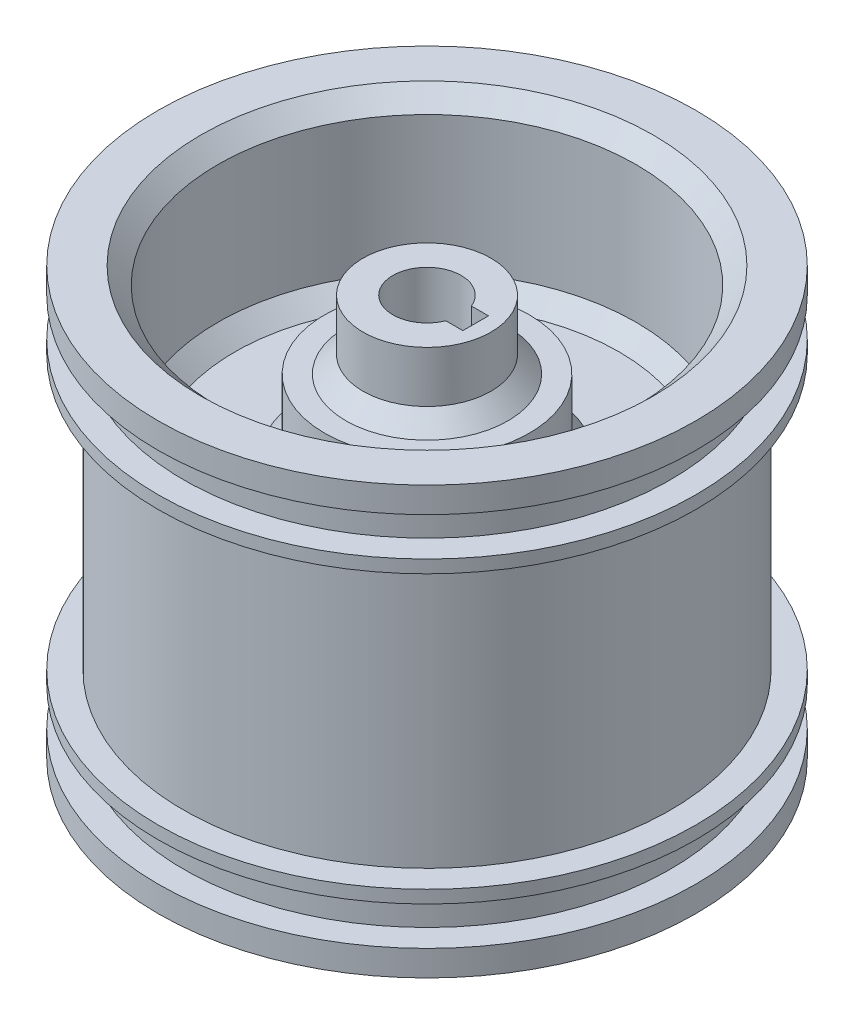
ISO-10303-21;
HEADER;
FILE_DESCRIPTION(('STEP AP214'),'2;1');
FILE_NAME('part.step','',(''),(''),'','','');
FILE_SCHEMA(('AUTOMOTIVE_DESIGN { 1 0 10303 214 1 1 1 1 }'));
ENDSEC;
DATA;
#1=APPLICATION_CONTEXT('core data for automotive mechanical design processes');
#2=APPLICATION_PROTOCOL_DEFINITION('international standard','automotive_design',2000,#1);
#3=PRODUCT_CONTEXT('',#1,'mechanical');
#4=PRODUCT('Part','Part','',(#3));
#5=PRODUCT_RELATED_PRODUCT_CATEGORY('part','',(#4));
#6=PRODUCT_DEFINITION_FORMATION('','',#4);
#7=PRODUCT_DEFINITION_CONTEXT('part definition',#1,'design');
#8=PRODUCT_DEFINITION('design','',#6,#7);
#9=PRODUCT_DEFINITION_SHAPE('','',#8);
#10=(LENGTH_UNIT() NAMED_UNIT(*) SI_UNIT(.MILLI.,.METRE.));
#11=(NAMED_UNIT(*) PLANE_ANGLE_UNIT() SI_UNIT($,.RADIAN.));
#12=(NAMED_UNIT(*) SI_UNIT($,.STERADIAN.) SOLID_ANGLE_UNIT());
#13=UNCERTAINTY_MEASURE_WITH_UNIT(LENGTH_MEASURE(1.E-05),#10,'distance_accuracy_value','');
#14=(GEOMETRIC_REPRESENTATION_CONTEXT(3) GLOBAL_UNCERTAINTY_ASSIGNED_CONTEXT((#13)) GLOBAL_UNIT_ASSIGNED_CONTEXT((#10,
#11,#12)) REPRESENTATION_CONTEXT('',''));
#15=CARTESIAN_POINT('',(0.,0.,0.));
#16=DIRECTION('',(0.,0.,1.));
#17=DIRECTION('',(1.,0.,0.));
#18=AXIS2_PLACEMENT_3D('',#15,#16,#17);
#19=CARTESIAN_POINT('',(5.7,-53.,0.));
#20=DIRECTION('',(-1.,0.,0.));
#21=DIRECTION('',(0.,0.,1.));
#22=AXIS2_PLACEMENT_3D('',#19,#20,#21);
#23=PLANE('',#22);
#24=DIRECTION('',(0.,1.,0.));
#25=VECTOR('',#24,1.);
#26=CARTESIAN_POINT('',(5.7,-53.,-1.5));
#27=LINE('',#26,#25);
#28=CARTESIAN_POINT('',(5.7,-30.,-1.5));
#29=VERTEX_POINT('',#28);
#30=CARTESIAN_POINT('',(5.7,-3.00000000000001,-1.5));
#31=VERTEX_POINT('',#30);
#32=EDGE_CURVE('E187',#29,#31,#27,.T.);
#33=ORIENTED_EDGE('',*,*,#32,.F.);
#34=DIRECTION('',(0.,0.,1.));
#35=VECTOR('',#34,1.);
#36=CARTESIAN_POINT('',(5.7,-30.,0.));
#37=LINE('',#36,#35);
#38=CARTESIAN_POINT('',(5.7,-30.,1.5));
#39=VERTEX_POINT('',#38);
#40=EDGE_CURVE('E61',#29,#39,#37,.T.);
#41=ORIENTED_EDGE('',*,*,#40,.T.);
#42=DIRECTION('',(0.,1.,0.));
#43=VECTOR('',#42,1.);
#44=CARTESIAN_POINT('',(5.7,-53.,1.5));
#45=LINE('',#44,#43);
#46=CARTESIAN_POINT('',(5.7,-3.00000000000001,1.5));
#47=VERTEX_POINT('',#46);
#48=EDGE_CURVE('E188',#39,#47,#45,.T.);
#49=ORIENTED_EDGE('',*,*,#48,.T.);
#50=DIRECTION('',(0.,0.,1.));
#51=VECTOR('',#50,1.);
#52=CARTESIAN_POINT('',(5.7,-3.00000000000001,0.));
#53=LINE('',#52,#51);
#54=EDGE_CURVE('E175',#31,#47,#53,.T.);
#55=ORIENTED_EDGE('',*,*,#54,.F.);
#56=EDGE_LOOP('',(#33,#41,#49,#55));
#57=FACE_BOUND('',#56,.T.);
#58=ADVANCED_FACE('F38',(#57),#23,.T.);
#59=CARTESIAN_POINT('',(0.,-53.,1.5));
#60=DIRECTION('',(0.,0.,-1.));
#61=DIRECTION('',(-1.,0.,0.));
#62=AXIS2_PLACEMENT_3D('',#59,#60,#61);
#63=PLANE('',#62);
#64=ORIENTED_EDGE('',*,*,#48,.F.);
#65=DIRECTION('',(-1.,0.,0.));
#66=VECTOR('',#65,1.);
#67=CARTESIAN_POINT('',(0.,-30.,1.5));
#68=LINE('',#67,#66);
#69=CARTESIAN_POINT('',(3.70809924354783,-30.,1.5));
#70=VERTEX_POINT('',#69);
#71=EDGE_CURVE('E171',#39,#70,#68,.T.);
#72=ORIENTED_EDGE('',*,*,#71,.T.);
#73=DIRECTION('',(0.,1.,0.));
#74=VECTOR('',#73,1.);
#75=CARTESIAN_POINT('',(3.70809924354783,-53.,1.5));
#76=LINE('',#75,#74);
#77=CARTESIAN_POINT('',(3.70809924354783,-3.00000000000001,1.5));
#78=VERTEX_POINT('',#77);
#79=EDGE_CURVE('E191',#70,#78,#76,.T.);
#80=ORIENTED_EDGE('',*,*,#79,.T.);
#81=DIRECTION('',(-1.,0.,0.));
#82=VECTOR('',#81,1.);
#83=CARTESIAN_POINT('',(0.,-3.00000000000001,1.5));
#84=LINE('',#83,#82);
#85=EDGE_CURVE('E184',#47,#78,#84,.T.);
#86=ORIENTED_EDGE('',*,*,#85,.F.);
#87=EDGE_LOOP('',(#64,#72,#80,#86));
#88=FACE_BOUND('',#87,.T.);
#89=ADVANCED_FACE('F310',(#88),#63,.T.);
#90=CARTESIAN_POINT('',(0.,-53.,0.));
#91=DIRECTION('',(0.,1.,0.));
#92=DIRECTION('',(0.,0.,1.));
#93=AXIS2_PLACEMENT_3D('',#90,#91,#92);
#94=CYLINDRICAL_SURFACE('',#93,4.);
#95=CARTESIAN_POINT('',(0.,-30.,0.));
#96=DIRECTION('',(0.,-1.,0.));
#97=DIRECTION('',(0.,0.,-1.));
#98=AXIS2_PLACEMENT_3D('',#95,#96,#97);
#99=CIRCLE('',#98,4.);
#100=CARTESIAN_POINT('',(3.70809924354783,-30.,-1.5));
#101=VERTEX_POINT('',#100);
#102=EDGE_CURVE('E162',#101,#70,#99,.F.);
#103=ORIENTED_EDGE('',*,*,#102,.F.);
#104=DIRECTION('',(0.,1.,0.));
#105=VECTOR('',#104,1.);
#106=CARTESIAN_POINT('',(3.70809924354783,-53.,-1.5));
#107=LINE('',#106,#105);
#108=CARTESIAN_POINT('',(3.70809924354783,-3.00000000000001,-1.5));
#109=VERTEX_POINT('',#108);
#110=EDGE_CURVE('E193',#101,#109,#107,.T.);
#111=ORIENTED_EDGE('',*,*,#110,.T.);
#112=CARTESIAN_POINT('',(0.,-3.00000000000001,0.));
#113=DIRECTION('',(0.,1.,0.));
#114=DIRECTION('',(0.,0.,1.));
#115=AXIS2_PLACEMENT_3D('',#112,#113,#114);
#116=CIRCLE('',#115,4.);
#117=EDGE_CURVE('E181',#109,#78,#116,.T.);
#118=ORIENTED_EDGE('',*,*,#117,.T.);
#119=ORIENTED_EDGE('',*,*,#79,.F.);
#120=EDGE_LOOP('',(#103,#111,#118,#119));
#121=FACE_BOUND('',#120,.T.);
#122=ADVANCED_FACE('F316',(#121),#94,.F.);
#123=CARTESIAN_POINT('',(0.,-53.,-1.5));
#124=DIRECTION('',(0.,0.,-1.));
#125=DIRECTION('',(-1.,0.,0.));
#126=AXIS2_PLACEMENT_3D('',#123,#124,#125);
#127=PLANE('',#126);
#128=DIRECTION('',(-1.,0.,0.));
#129=VECTOR('',#128,1.);
#130=CARTESIAN_POINT('',(0.,-30.,-1.5));
#131=LINE('',#130,#129);
#132=EDGE_CURVE('E246',#29,#101,#131,.T.);
#133=ORIENTED_EDGE('',*,*,#132,.F.);
#134=ORIENTED_EDGE('',*,*,#32,.T.);
#135=DIRECTION('',(-1.,0.,0.));
#136=VECTOR('',#135,1.);
#137=CARTESIAN_POINT('',(0.,-3.00000000000001,-1.5));
#138=LINE('',#137,#136);
#139=EDGE_CURVE('E178',#31,#109,#138,.T.);
#140=ORIENTED_EDGE('',*,*,#139,.T.);
#141=ORIENTED_EDGE('',*,*,#110,.F.);
#142=EDGE_LOOP('',(#133,#134,#140,#141));
#143=FACE_BOUND('',#142,.T.);
#144=ADVANCED_FACE('F322',(#143),#127,.F.);
#145=CARTESIAN_POINT('',(0.,-3.00000000000001,0.));
#146=DIRECTION('',(0.,1.,0.));
#147=DIRECTION('',(0.,0.,1.));
#148=AXIS2_PLACEMENT_3D('',#145,#146,#147);
#149=PLANE('',#148);
#150=CARTESIAN_POINT('',(0.,-3.00000000000001,0.));
#151=DIRECTION('',(0.,-1.,0.));
#152=DIRECTION('',(0.,0.,-1.));
#153=AXIS2_PLACEMENT_3D('',#150,#151,#152);
#154=CIRCLE('',#153,7.5);
#155=CARTESIAN_POINT('',(0.,-3.00000000000001,-7.5));
#156=VERTEX_POINT('',#155);
#157=EDGE_CURVE('E198',#156,#156,#154,.T.);
#158=ORIENTED_EDGE('',*,*,#157,.F.);
#159=EDGE_LOOP('',(#158));
#160=FACE_BOUND('',#159,.T.);
#161=ORIENTED_EDGE('',*,*,#139,.F.);
#162=ORIENTED_EDGE('',*,*,#54,.T.);
#163=ORIENTED_EDGE('',*,*,#85,.T.);
#164=ORIENTED_EDGE('',*,*,#117,.F.);
#165=EDGE_LOOP('',(#161,#162,#163,#164));
#166=FACE_BOUND('',#165,.T.);
#167=ADVANCED_FACE('F326',(#160,#166),#149,.T.);
#168=CARTESIAN_POINT('',(0.,-38.,0.));
#169=DIRECTION('',(0.,1.,0.));
#170=DIRECTION('',(0.,0.,1.));
#171=AXIS2_PLACEMENT_3D('',#168,#169,#170);
#172=PLANE('',#171);
#173=DIRECTION('',(-0.5,0.,0.866025403784439));
#174=VECTOR('',#173,1.);
#175=CARTESIAN_POINT('',(6.92820323027551,-38.,0.));
#176=LINE('',#175,#174);
#177=CARTESIAN_POINT('',(6.92820323027551,-38.,0.));
#178=VERTEX_POINT('',#177);
#179=CARTESIAN_POINT('',(3.46410161513776,-38.,6.00000000000001));
#180=VERTEX_POINT('',#179);
#181=EDGE_CURVE('E150',#178,#180,#176,.T.);
#182=ORIENTED_EDGE('',*,*,#181,.F.);
#183=DIRECTION('',(0.5,0.,0.866025403784439));
#184=VECTOR('',#183,1.);
#185=CARTESIAN_POINT('',(3.46410161513776,-38.,-6.));
#186=LINE('',#185,#184);
#187=CARTESIAN_POINT('',(3.46410161513776,-38.,-6.));
#188=VERTEX_POINT('',#187);
#189=EDGE_CURVE('E53',#188,#178,#186,.T.);
#190=ORIENTED_EDGE('',*,*,#189,.F.);
#191=DIRECTION('',(1.,0.,0.));
#192=VECTOR('',#191,1.);
#193=CARTESIAN_POINT('',(-3.46410161513776,-38.,-6.00000000000001));
#194=LINE('',#193,#192);
#195=CARTESIAN_POINT('',(-3.46410161513776,-38.,-6.00000000000001));
#196=VERTEX_POINT('',#195);
#197=EDGE_CURVE('E136',#196,#188,#194,.T.);
#198=ORIENTED_EDGE('',*,*,#197,.F.);
#199=DIRECTION('',(0.5,0.,-0.866025403784439));
#200=VECTOR('',#199,1.);
#201=CARTESIAN_POINT('',(-6.92820323027551,-38.,0.));
#202=LINE('',#201,#200);
#203=CARTESIAN_POINT('',(-6.92820323027551,-38.,0.));
#204=VERTEX_POINT('',#203);
#205=EDGE_CURVE('E139',#204,#196,#202,.T.);
#206=ORIENTED_EDGE('',*,*,#205,.F.);
#207=DIRECTION('',(-0.5,0.,-0.866025403784439));
#208=VECTOR('',#207,1.);
#209=CARTESIAN_POINT('',(-3.46410161513776,-38.,6.00000000000001));
#210=LINE('',#209,#208);
#211=CARTESIAN_POINT('',(-3.46410161513776,-38.,6.00000000000001));
#212=VERTEX_POINT('',#211);
#213=EDGE_CURVE('E155',#212,#204,#210,.T.);
#214=ORIENTED_EDGE('',*,*,#213,.F.);
#215=DIRECTION('',(-1.,0.,0.));
#216=VECTOR('',#215,1.);
#217=CARTESIAN_POINT('',(3.46410161513776,-38.,6.00000000000001));
#218=LINE('',#217,#216);
#219=EDGE_CURVE('E152',#180,#212,#218,.T.);
#220=ORIENTED_EDGE('',*,*,#219,.F.);
#221=EDGE_LOOP('',(#182,#190,#198,#206,#214,#220));
#222=FACE_BOUND('',#221,.T.);
#223=CARTESIAN_POINT('',(0.,-38.,0.));
#224=DIRECTION('',(0.,-1.,0.));
#225=DIRECTION('',(0.,0.,-1.));
#226=AXIS2_PLACEMENT_3D('',#223,#224,#225);
#227=CIRCLE('',#226,10.);
#228=CARTESIAN_POINT('',(0.,-38.,-10.));
#229=VERTEX_POINT('',#228);
#230=EDGE_CURVE('E190',#229,#229,#227,.T.);
#231=ORIENTED_EDGE('',*,*,#230,.T.);
#232=EDGE_LOOP('',(#231));
#233=FACE_BOUND('',#232,.T.);
#234=ADVANCED_FACE('F306',(#222,#233),#172,.F.);
#235=CARTESIAN_POINT('',(0.,0.,0.));
#236=DIRECTION('',(0.,-1.,0.));
#237=DIRECTION('',(0.,0.,-1.));
#238=AXIS2_PLACEMENT_3D('',#235,#236,#237);
#239=CYLINDRICAL_SURFACE('',#238,10.);
#240=CARTESIAN_POINT('',(0.,-32.,0.));
#241=DIRECTION('',(0.,-1.,0.));
#242=DIRECTION('',(0.,0.,-1.));
#243=AXIS2_PLACEMENT_3D('',#240,#241,#242);
#244=CIRCLE('',#243,10.);
#245=CARTESIAN_POINT('',(0.,-32.,-10.));
#246=VERTEX_POINT('',#245);
#247=EDGE_CURVE('E248',#246,#246,#244,.T.);
#248=ORIENTED_EDGE('',*,*,#247,.T.);
#249=EDGE_LOOP('',(#248));
#250=FACE_BOUND('',#249,.T.);
#251=ORIENTED_EDGE('',*,*,#230,.F.);
#252=EDGE_LOOP('',(#251));
#253=FACE_BOUND('',#252,.T.);
#254=ADVANCED_FACE('F297',(#250,#253),#239,.T.);
#255=CARTESIAN_POINT('',(0.,-30.,0.));
#256=DIRECTION('',(0.,-1.,0.));
#257=DIRECTION('',(0.,0.,-1.));
#258=AXIS2_PLACEMENT_3D('',#255,#256,#257);
#259=PLANE('',#258);
#260=CARTESIAN_POINT('',(0.,-30.,0.));
#261=DIRECTION('',(0.,-1.,0.));
#262=DIRECTION('',(0.,0.,-1.));
#263=AXIS2_PLACEMENT_3D('',#260,#261,#262);
#264=CIRCLE('',#263,12.);
#265=CARTESIAN_POINT('',(0.,-30.,-12.));
#266=VERTEX_POINT('',#265);
#267=EDGE_CURVE('E254',#266,#266,#264,.F.);
#268=ORIENTED_EDGE('',*,*,#267,.T.);
#269=EDGE_LOOP('',(#268));
#270=FACE_BOUND('',#269,.T.);
#271=CARTESIAN_POINT('',(0.,-30.,0.));
#272=DIRECTION('',(0.,-1.,0.));
#273=DIRECTION('',(0.,0.,-1.));
#274=AXIS2_PLACEMENT_3D('',#271,#272,#273);
#275=CIRCLE('',#274,22.5);
#276=CARTESIAN_POINT('',(0.,-30.,-22.5));
#277=VERTEX_POINT('',#276);
#278=EDGE_CURVE('E251',#277,#277,#275,.T.);
#279=ORIENTED_EDGE('',*,*,#278,.T.);
#280=EDGE_LOOP('',(#279));
#281=FACE_BOUND('',#280,.T.);
#282=ADVANCED_FACE('F295',(#270,#281),#259,.T.);
#283=CARTESIAN_POINT('',(0.,0.,0.));
#284=DIRECTION('',(0.,-1.,0.));
#285=DIRECTION('',(0.,0.,-1.));
#286=AXIS2_PLACEMENT_3D('',#283,#284,#285);
#287=CYLINDRICAL_SURFACE('',#286,24.5);
#288=CARTESIAN_POINT('',(0.,-32.,0.));
#289=DIRECTION('',(0.,-1.,0.));
#290=DIRECTION('',(0.,0.,-1.));
#291=AXIS2_PLACEMENT_3D('',#288,#289,#290);
#292=CIRCLE('',#291,24.5);
#293=CARTESIAN_POINT('',(0.,-32.,-24.5));
#294=VERTEX_POINT('',#293);
#295=EDGE_CURVE('E46',#294,#294,#292,.F.);
#296=ORIENTED_EDGE('',*,*,#295,.T.);
#297=EDGE_LOOP('',(#296));
#298=FACE_BOUND('',#297,.T.);
#299=CARTESIAN_POINT('',(0.,-48.,0.));
#300=DIRECTION('',(0.,-1.,0.));
#301=DIRECTION('',(0.,0.,-1.));
#302=AXIS2_PLACEMENT_3D('',#299,#300,#301);
#303=CIRCLE('',#302,24.5);
#304=CARTESIAN_POINT('',(0.,-48.,-24.5));
#305=VERTEX_POINT('',#304);
#306=EDGE_CURVE('E281',#305,#305,#303,.T.);
#307=ORIENTED_EDGE('',*,*,#306,.T.);
#308=EDGE_LOOP('',(#307));
#309=FACE_BOUND('',#308,.T.);
#310=ADVANCED_FACE('F286',(#298,#309),#287,.F.);
#311=CARTESIAN_POINT('',(0.,-50.,0.));
#312=DIRECTION('',(0.,-1.,0.));
#313=DIRECTION('',(0.,0.,-1.));
#314=AXIS2_PLACEMENT_3D('',#311,#312,#313);
#315=PLANE('',#314);
#316=CARTESIAN_POINT('',(0.,-50.,0.));
#317=DIRECTION('',(0.,-1.,0.));
#318=DIRECTION('',(0.,0.,-1.));
#319=AXIS2_PLACEMENT_3D('',#316,#317,#318);
#320=CIRCLE('',#319,26.5);
#321=CARTESIAN_POINT('',(0.,-50.,-26.5));
#322=VERTEX_POINT('',#321);
#323=EDGE_CURVE('E11',#322,#322,#320,.F.);
#324=ORIENTED_EDGE('',*,*,#323,.T.);
#325=EDGE_LOOP('',(#324));
#326=FACE_BOUND('',#325,.T.);
#327=CARTESIAN_POINT('',(0.,-50.,0.));
#328=DIRECTION('',(0.,-1.,0.));
#329=DIRECTION('',(0.,0.,-1.));
#330=AXIS2_PLACEMENT_3D('',#327,#328,#329);
#331=CIRCLE('',#330,31.5);
#332=CARTESIAN_POINT('',(0.,-50.,-31.5));
#333=VERTEX_POINT('',#332);
#334=EDGE_CURVE('E243',#333,#333,#331,.T.);
#335=ORIENTED_EDGE('',*,*,#334,.T.);
#336=EDGE_LOOP('',(#335));
#337=FACE_BOUND('',#336,.T.);
#338=ADVANCED_FACE('F304',(#326,#337),#315,.T.);
#339=CARTESIAN_POINT('',(0.,0.,0.));
#340=DIRECTION('',(0.,-1.,0.));
#341=DIRECTION('',(0.,0.,-1.));
#342=AXIS2_PLACEMENT_3D('',#339,#340,#341);
#343=CYLINDRICAL_SURFACE('',#342,31.5);
#344=CARTESIAN_POINT('',(0.,-47.,0.));
#345=DIRECTION('',(0.,-1.,0.));
#346=DIRECTION('',(0.,0.,-1.));
#347=AXIS2_PLACEMENT_3D('',#344,#345,#346);
#348=CIRCLE('',#347,31.5);
#349=CARTESIAN_POINT('',(0.,-47.,-31.5));
#350=VERTEX_POINT('',#349);
#351=EDGE_CURVE('E240',#350,#350,#348,.T.);
#352=ORIENTED_EDGE('',*,*,#351,.T.);
#353=EDGE_LOOP('',(#352));
#354=FACE_BOUND('',#353,.T.);
#355=ORIENTED_EDGE('',*,*,#334,.F.);
#356=EDGE_LOOP('',(#355));
#357=FACE_BOUND('',#356,.T.);
#358=ADVANCED_FACE('F402',(#354,#357),#343,.T.);
#359=CARTESIAN_POINT('',(-4.34837351311517E-13,-47.,0.));
#360=DIRECTION('',(0.,1.,0.));
#361=DIRECTION('',(0.,0.,1.));
#362=AXIS2_PLACEMENT_3D('',#359,#360,#361);
#363=PLANE('',#362);
#364=CARTESIAN_POINT('',(0.,-47.,0.));
#365=DIRECTION('',(0.,-1.,0.));
#366=DIRECTION('',(0.,0.,-1.));
#367=AXIS2_PLACEMENT_3D('',#364,#365,#366);
#368=CIRCLE('',#367,28.5);
#369=CARTESIAN_POINT('',(0.,-47.,-28.5));
#370=VERTEX_POINT('',#369);
#371=EDGE_CURVE('E237',#370,#370,#368,.T.);
#372=ORIENTED_EDGE('',*,*,#371,.T.);
#373=EDGE_LOOP('',(#372));
#374=FACE_BOUND('',#373,.T.);
#375=ORIENTED_EDGE('',*,*,#351,.F.);
#376=EDGE_LOOP('',(#375));
#377=FACE_BOUND('',#376,.T.);
#378=ADVANCED_FACE('F398',(#374,#377),#363,.T.);
#379=CARTESIAN_POINT('',(0.,0.,0.));
#380=DIRECTION('',(0.,-1.,0.));
#381=DIRECTION('',(0.,0.,-1.));
#382=AXIS2_PLACEMENT_3D('',#379,#380,#381);
#383=CYLINDRICAL_SURFACE('',#382,28.5);
#384=CARTESIAN_POINT('',(0.,-42.5,0.));
#385=DIRECTION('',(0.,-1.,0.));
#386=DIRECTION('',(0.,0.,-1.));
#387=AXIS2_PLACEMENT_3D('',#384,#385,#386);
#388=CIRCLE('',#387,28.5);
#389=CARTESIAN_POINT('',(0.,-42.5,-28.5));
#390=VERTEX_POINT('',#389);
#391=EDGE_CURVE('E234',#390,#390,#388,.T.);
#392=ORIENTED_EDGE('',*,*,#391,.T.);
#393=EDGE_LOOP('',(#392));
#394=FACE_BOUND('',#393,.T.);
#395=ORIENTED_EDGE('',*,*,#371,.F.);
#396=EDGE_LOOP('',(#395));
#397=FACE_BOUND('',#396,.T.);
#398=ADVANCED_FACE('F394',(#394,#397),#383,.T.);
#399=CARTESIAN_POINT('',(0.,-42.5,0.));
#400=DIRECTION('',(0.,-1.,0.));
#401=DIRECTION('',(0.,0.,-1.));
#402=AXIS2_PLACEMENT_3D('',#399,#400,#401);
#403=PLANE('',#402);
#404=CARTESIAN_POINT('',(0.,-42.5,0.));
#405=DIRECTION('',(0.,-1.,0.));
#406=DIRECTION('',(0.,0.,-1.));
#407=AXIS2_PLACEMENT_3D('',#404,#405,#406);
#408=CIRCLE('',#407,31.5);
#409=CARTESIAN_POINT('',(0.,-42.5,-31.5));
#410=VERTEX_POINT('',#409);
#411=EDGE_CURVE('E231',#410,#410,#408,.T.);
#412=ORIENTED_EDGE('',*,*,#411,.T.);
#413=EDGE_LOOP('',(#412));
#414=FACE_BOUND('',#413,.T.);
#415=ORIENTED_EDGE('',*,*,#391,.F.);
#416=EDGE_LOOP('',(#415));
#417=FACE_BOUND('',#416,.T.);
#418=ADVANCED_FACE('F390',(#414,#417),#403,.T.);
#419=CARTESIAN_POINT('',(0.,0.,0.));
#420=DIRECTION('',(0.,-1.,0.));
#421=DIRECTION('',(0.,0.,-1.));
#422=AXIS2_PLACEMENT_3D('',#419,#420,#421);
#423=CYLINDRICAL_SURFACE('',#422,31.5);
#424=CARTESIAN_POINT('',(0.,-41.,0.));
#425=DIRECTION('',(0.,-1.,0.));
#426=DIRECTION('',(0.,0.,-1.));
#427=AXIS2_PLACEMENT_3D('',#424,#425,#426);
#428=CIRCLE('',#427,31.5);
#429=CARTESIAN_POINT('',(0.,-41.,-31.5));
#430=VERTEX_POINT('',#429);
#431=EDGE_CURVE('E228',#430,#430,#428,.T.);
#432=ORIENTED_EDGE('',*,*,#431,.T.);
#433=EDGE_LOOP('',(#432));
#434=FACE_BOUND('',#433,.T.);
#435=ORIENTED_EDGE('',*,*,#411,.F.);
#436=EDGE_LOOP('',(#435));
#437=FACE_BOUND('',#436,.T.);
#438=ADVANCED_FACE('F386',(#434,#437),#423,.T.);
#439=CARTESIAN_POINT('',(0.,-41.,0.));
#440=DIRECTION('',(0.,1.,0.));
#441=DIRECTION('',(0.,0.,1.));
#442=AXIS2_PLACEMENT_3D('',#439,#440,#441);
#443=PLANE('',#442);
#444=CARTESIAN_POINT('',(0.,-41.,0.));
#445=DIRECTION('',(0.,-1.,0.));
#446=DIRECTION('',(0.,0.,-1.));
#447=AXIS2_PLACEMENT_3D('',#444,#445,#446);
#448=CIRCLE('',#447,28.5);
#449=CARTESIAN_POINT('',(0.,-41.,-28.5));
#450=VERTEX_POINT('',#449);
#451=EDGE_CURVE('E225',#450,#450,#448,.T.);
#452=ORIENTED_EDGE('',*,*,#451,.T.);
#453=EDGE_LOOP('',(#452));
#454=FACE_BOUND('',#453,.T.);
#455=ORIENTED_EDGE('',*,*,#431,.F.);
#456=EDGE_LOOP('',(#455));
#457=FACE_BOUND('',#456,.T.);
#458=ADVANCED_FACE('F382',(#454,#457),#443,.T.);
#459=CARTESIAN_POINT('',(0.,0.,0.));
#460=DIRECTION('',(0.,-1.,0.));
#461=DIRECTION('',(0.,0.,-1.));
#462=AXIS2_PLACEMENT_3D('',#459,#460,#461);
#463=CYLINDRICAL_SURFACE('',#462,28.5);
#464=ORIENTED_EDGE('',*,*,#451,.F.);
#465=EDGE_LOOP('',(#464));
#466=FACE_BOUND('',#465,.T.);
#467=CARTESIAN_POINT('',(0.,-9.00000000000001,0.));
#468=DIRECTION('',(0.,-1.,0.));
#469=DIRECTION('',(0.,0.,-1.));
#470=AXIS2_PLACEMENT_3D('',#467,#468,#469);
#471=CIRCLE('',#470,28.5);
#472=CARTESIAN_POINT('',(0.,-9.00000000000001,-28.5));
#473=VERTEX_POINT('',#472);
#474=EDGE_CURVE('E222',#473,#473,#471,.T.);
#475=ORIENTED_EDGE('',*,*,#474,.T.);
#476=EDGE_LOOP('',(#475));
#477=FACE_BOUND('',#476,.T.);
#478=ADVANCED_FACE('F378',(#466,#477),#463,.T.);
#479=CARTESIAN_POINT('',(0.,-9.00000000000001,0.));
#480=DIRECTION('',(0.,1.,0.));
#481=DIRECTION('',(0.,0.,1.));
#482=AXIS2_PLACEMENT_3D('',#479,#480,#481);
#483=PLANE('',#482);
#484=ORIENTED_EDGE('',*,*,#474,.F.);
#485=EDGE_LOOP('',(#484));
#486=FACE_BOUND('',#485,.T.);
#487=CARTESIAN_POINT('',(0.,-9.00000000000001,0.));
#488=DIRECTION('',(0.,-1.,0.));
#489=DIRECTION('',(0.,0.,-1.));
#490=AXIS2_PLACEMENT_3D('',#487,#488,#489);
#491=CIRCLE('',#490,31.5);
#492=CARTESIAN_POINT('',(0.,-9.00000000000001,-31.5));
#493=VERTEX_POINT('',#492);
#494=EDGE_CURVE('E219',#493,#493,#491,.T.);
#495=ORIENTED_EDGE('',*,*,#494,.T.);
#496=EDGE_LOOP('',(#495));
#497=FACE_BOUND('',#496,.T.);
#498=ADVANCED_FACE('F374',(#486,#497),#483,.F.);
#499=CARTESIAN_POINT('',(0.,0.,0.));
#500=DIRECTION('',(0.,-1.,0.));
#501=DIRECTION('',(0.,0.,-1.));
#502=AXIS2_PLACEMENT_3D('',#499,#500,#501);
#503=CYLINDRICAL_SURFACE('',#502,31.5);
#504=ORIENTED_EDGE('',*,*,#494,.F.);
#505=EDGE_LOOP('',(#504));
#506=FACE_BOUND('',#505,.T.);
#507=CARTESIAN_POINT('',(0.,-7.50000000000001,0.));
#508=DIRECTION('',(0.,-1.,0.));
#509=DIRECTION('',(0.,0.,-1.));
#510=AXIS2_PLACEMENT_3D('',#507,#508,#509);
#511=CIRCLE('',#510,31.5);
#512=CARTESIAN_POINT('',(0.,-7.50000000000001,-31.5));
#513=VERTEX_POINT('',#512);
#514=EDGE_CURVE('E216',#513,#513,#511,.T.);
#515=ORIENTED_EDGE('',*,*,#514,.T.);
#516=EDGE_LOOP('',(#515));
#517=FACE_BOUND('',#516,.T.);
#518=ADVANCED_FACE('F370',(#506,#517),#503,.T.);
#519=CARTESIAN_POINT('',(0.,-7.50000000000001,0.));
#520=DIRECTION('',(0.,-1.,0.));
#521=DIRECTION('',(0.,0.,-1.));
#522=AXIS2_PLACEMENT_3D('',#519,#520,#521);
#523=PLANE('',#522);
#524=ORIENTED_EDGE('',*,*,#514,.F.);
#525=EDGE_LOOP('',(#524));
#526=FACE_BOUND('',#525,.T.);
#527=CARTESIAN_POINT('',(0.,-7.50000000000001,0.));
#528=DIRECTION('',(0.,-1.,0.));
#529=DIRECTION('',(0.,0.,-1.));
#530=AXIS2_PLACEMENT_3D('',#527,#528,#529);
#531=CIRCLE('',#530,28.5);
#532=CARTESIAN_POINT('',(0.,-7.50000000000001,-28.5));
#533=VERTEX_POINT('',#532);
#534=EDGE_CURVE('E213',#533,#533,#531,.T.);
#535=ORIENTED_EDGE('',*,*,#534,.T.);
#536=EDGE_LOOP('',(#535));
#537=FACE_BOUND('',#536,.T.);
#538=ADVANCED_FACE('F366',(#526,#537),#523,.F.);
#539=CARTESIAN_POINT('',(0.,0.,0.));
#540=DIRECTION('',(0.,-1.,0.));
#541=DIRECTION('',(0.,0.,-1.));
#542=AXIS2_PLACEMENT_3D('',#539,#540,#541);
#543=CYLINDRICAL_SURFACE('',#542,28.5);
#544=ORIENTED_EDGE('',*,*,#534,.F.);
#545=EDGE_LOOP('',(#544));
#546=FACE_BOUND('',#545,.T.);
#547=CARTESIAN_POINT('',(0.,-3.00000000000001,0.));
#548=DIRECTION('',(0.,-1.,0.));
#549=DIRECTION('',(0.,0.,-1.));
#550=AXIS2_PLACEMENT_3D('',#547,#548,#549);
#551=CIRCLE('',#550,28.5);
#552=CARTESIAN_POINT('',(0.,-3.00000000000001,-28.5));
#553=VERTEX_POINT('',#552);
#554=EDGE_CURVE('E210',#553,#553,#551,.T.);
#555=ORIENTED_EDGE('',*,*,#554,.T.);
#556=EDGE_LOOP('',(#555));
#557=FACE_BOUND('',#556,.T.);
#558=ADVANCED_FACE('F362',(#546,#557),#543,.T.);
#559=CARTESIAN_POINT('',(0.,-3.00000000000001,0.));
#560=DIRECTION('',(0.,1.,0.));
#561=DIRECTION('',(0.,0.,1.));
#562=AXIS2_PLACEMENT_3D('',#559,#560,#561);
#563=PLANE('',#562);
#564=ORIENTED_EDGE('',*,*,#554,.F.);
#565=EDGE_LOOP('',(#564));
#566=FACE_BOUND('',#565,.T.);
#567=CARTESIAN_POINT('',(0.,-3.00000000000001,0.));
#568=DIRECTION('',(0.,-1.,0.));
#569=DIRECTION('',(0.,0.,-1.));
#570=AXIS2_PLACEMENT_3D('',#567,#568,#569);
#571=CIRCLE('',#570,31.5);
#572=CARTESIAN_POINT('',(0.,-3.00000000000001,-31.5));
#573=VERTEX_POINT('',#572);
#574=EDGE_CURVE('E207',#573,#573,#571,.T.);
#575=ORIENTED_EDGE('',*,*,#574,.T.);
#576=EDGE_LOOP('',(#575));
#577=FACE_BOUND('',#576,.T.);
#578=ADVANCED_FACE('F358',(#566,#577),#563,.F.);
#579=CARTESIAN_POINT('',(0.,0.,0.));
#580=DIRECTION('',(0.,-1.,0.));
#581=DIRECTION('',(0.,0.,-1.));
#582=AXIS2_PLACEMENT_3D('',#579,#580,#581);
#583=CYLINDRICAL_SURFACE('',#582,31.5);
#584=ORIENTED_EDGE('',*,*,#574,.F.);
#585=EDGE_LOOP('',(#584));
#586=FACE_BOUND('',#585,.T.);
#587=CARTESIAN_POINT('',(0.,0.,0.));
#588=DIRECTION('',(0.,-1.,0.));
#589=DIRECTION('',(0.,0.,-1.));
#590=AXIS2_PLACEMENT_3D('',#587,#588,#589);
#591=CIRCLE('',#590,31.5);
#592=CARTESIAN_POINT('',(0.,0.,-31.5));
#593=VERTEX_POINT('',#592);
#594=EDGE_CURVE('E204',#593,#593,#591,.T.);
#595=ORIENTED_EDGE('',*,*,#594,.T.);
#596=EDGE_LOOP('',(#595));
#597=FACE_BOUND('',#596,.T.);
#598=ADVANCED_FACE('F354',(#586,#597),#583,.T.);
#599=CARTESIAN_POINT('',(0.,0.,0.));
#600=DIRECTION('',(0.,-1.,0.));
#601=DIRECTION('',(0.,0.,-1.));
#602=AXIS2_PLACEMENT_3D('',#599,#600,#601);
#603=PLANE('',#602);
#604=CARTESIAN_POINT('',(0.,0.,0.));
#605=DIRECTION('',(0.,-1.,0.));
#606=DIRECTION('',(0.,0.,-1.));
#607=AXIS2_PLACEMENT_3D('',#604,#605,#606);
#608=CIRCLE('',#607,26.5);
#609=CARTESIAN_POINT('',(0.,0.,-26.5));
#610=VERTEX_POINT('',#609);
#611=EDGE_CURVE('E272',#610,#610,#608,.T.);
#612=ORIENTED_EDGE('',*,*,#611,.T.);
#613=EDGE_LOOP('',(#612));
#614=FACE_BOUND('',#613,.T.);
#615=ORIENTED_EDGE('',*,*,#594,.F.);
#616=EDGE_LOOP('',(#615));
#617=FACE_BOUND('',#616,.T.);
#618=ADVANCED_FACE('F350',(#614,#617),#603,.F.);
#619=CARTESIAN_POINT('',(0.,0.,0.));
#620=DIRECTION('',(0.,-1.,0.));
#621=DIRECTION('',(0.,0.,-1.));
#622=AXIS2_PLACEMENT_3D('',#619,#620,#621);
#623=CYLINDRICAL_SURFACE('',#622,24.5);
#624=CARTESIAN_POINT('',(0.,-2.,0.));
#625=DIRECTION('',(0.,-1.,0.));
#626=DIRECTION('',(0.,0.,-1.));
#627=AXIS2_PLACEMENT_3D('',#624,#625,#626);
#628=CIRCLE('',#627,24.5);
#629=CARTESIAN_POINT('',(0.,-2.,-24.5));
#630=VERTEX_POINT('',#629);
#631=EDGE_CURVE('E278',#630,#630,#628,.F.);
#632=ORIENTED_EDGE('',*,*,#631,.T.);
#633=EDGE_LOOP('',(#632));
#634=FACE_BOUND('',#633,.T.);
#635=CARTESIAN_POINT('',(0.,-18.,0.));
#636=DIRECTION('',(0.,-1.,0.));
#637=DIRECTION('',(0.,0.,-1.));
#638=AXIS2_PLACEMENT_3D('',#635,#636,#637);
#639=CIRCLE('',#638,24.5);
#640=CARTESIAN_POINT('',(0.,-18.,-24.5));
#641=VERTEX_POINT('',#640);
#642=EDGE_CURVE('E275',#641,#641,#639,.T.);
#643=ORIENTED_EDGE('',*,*,#642,.T.);
#644=EDGE_LOOP('',(#643));
#645=FACE_BOUND('',#644,.T.);
#646=ADVANCED_FACE('F346',(#634,#645),#623,.F.);
#647=CARTESIAN_POINT('',(0.,-20.,0.));
#648=DIRECTION('',(0.,-1.,0.));
#649=DIRECTION('',(0.,0.,-1.));
#650=AXIS2_PLACEMENT_3D('',#647,#648,#649);
#651=PLANE('',#650);
#652=CARTESIAN_POINT('',(0.,-20.,0.));
#653=DIRECTION('',(0.,-1.,0.));
#654=DIRECTION('',(0.,0.,-1.));
#655=AXIS2_PLACEMENT_3D('',#652,#653,#654);
#656=CIRCLE('',#655,14.);
#657=CARTESIAN_POINT('',(0.,-20.,-14.));
#658=VERTEX_POINT('',#657);
#659=EDGE_CURVE('E266',#658,#658,#656,.T.);
#660=ORIENTED_EDGE('',*,*,#659,.T.);
#661=EDGE_LOOP('',(#660));
#662=FACE_BOUND('',#661,.T.);
#663=CARTESIAN_POINT('',(0.,-20.,0.));
#664=DIRECTION('',(0.,-1.,0.));
#665=DIRECTION('',(0.,0.,-1.));
#666=AXIS2_PLACEMENT_3D('',#663,#664,#665);
#667=CIRCLE('',#666,22.5);
#668=CARTESIAN_POINT('',(0.,-20.,-22.5));
#669=VERTEX_POINT('',#668);
#670=EDGE_CURVE('E263',#669,#669,#667,.F.);
#671=ORIENTED_EDGE('',*,*,#670,.T.);
#672=EDGE_LOOP('',(#671));
#673=FACE_BOUND('',#672,.T.);
#674=ADVANCED_FACE('F342',(#662,#673),#651,.F.);
#675=CARTESIAN_POINT('',(0.,0.,0.));
#676=DIRECTION('',(0.,-1.,0.));
#677=DIRECTION('',(0.,0.,-1.));
#678=AXIS2_PLACEMENT_3D('',#675,#676,#677);
#679=CYLINDRICAL_SURFACE('',#678,12.);
#680=CARTESIAN_POINT('',(0.,-18.,0.));
#681=DIRECTION('',(0.,-1.,0.));
#682=DIRECTION('',(0.,0.,-1.));
#683=AXIS2_PLACEMENT_3D('',#680,#681,#682);
#684=CIRCLE('',#683,12.);
#685=CARTESIAN_POINT('',(0.,-18.,-12.));
#686=VERTEX_POINT('',#685);
#687=EDGE_CURVE('E269',#686,#686,#684,.F.);
#688=ORIENTED_EDGE('',*,*,#687,.T.);
#689=EDGE_LOOP('',(#688));
#690=FACE_BOUND('',#689,.T.);
#691=CARTESIAN_POINT('',(0.,-11.,0.));
#692=DIRECTION('',(0.,-1.,0.));
#693=DIRECTION('',(0.,0.,-1.));
#694=AXIS2_PLACEMENT_3D('',#691,#692,#693);
#695=CIRCLE('',#694,12.);
#696=CARTESIAN_POINT('',(0.,-11.,-12.));
#697=VERTEX_POINT('',#696);
#698=EDGE_CURVE('E201',#697,#697,#695,.T.);
#699=ORIENTED_EDGE('',*,*,#698,.T.);
#700=EDGE_LOOP('',(#699));
#701=FACE_BOUND('',#700,.T.);
#702=ADVANCED_FACE('F338',(#690,#701),#679,.T.);
#703=CARTESIAN_POINT('',(0.,-11.,0.));
#704=DIRECTION('',(0.,1.,0.));
#705=DIRECTION('',(0.,0.,1.));
#706=AXIS2_PLACEMENT_3D('',#703,#704,#705);
#707=PLANE('',#706);
#708=CARTESIAN_POINT('',(0.,-11.,0.));
#709=DIRECTION('',(0.,1.,0.));
#710=DIRECTION('',(0.,0.,1.));
#711=AXIS2_PLACEMENT_3D('',#708,#709,#710);
#712=CIRCLE('',#711,9.49999999999999);
#713=CARTESIAN_POINT('',(0.,-11.,9.49999999999999));
#714=VERTEX_POINT('',#713);
#715=EDGE_CURVE('E257',#714,#714,#712,.F.);
#716=ORIENTED_EDGE('',*,*,#715,.T.);
#717=EDGE_LOOP('',(#716));
#718=FACE_BOUND('',#717,.T.);
#719=ORIENTED_EDGE('',*,*,#698,.F.);
#720=EDGE_LOOP('',(#719));
#721=FACE_BOUND('',#720,.T.);
#722=ADVANCED_FACE('F334',(#718,#721),#707,.T.);
#723=CARTESIAN_POINT('',(0.,0.,0.));
#724=DIRECTION('',(0.,-1.,0.));
#725=DIRECTION('',(0.,0.,-1.));
#726=AXIS2_PLACEMENT_3D('',#723,#724,#725);
#727=CYLINDRICAL_SURFACE('',#726,7.5);
#728=CARTESIAN_POINT('',(0.,-9.00000000000002,0.));
#729=DIRECTION('',(0.,1.,0.));
#730=DIRECTION('',(0.,0.,1.));
#731=AXIS2_PLACEMENT_3D('',#728,#729,#730);
#732=CIRCLE('',#731,7.5);
#733=CARTESIAN_POINT('',(0.,-9.00000000000002,7.5));
#734=VERTEX_POINT('',#733);
#735=EDGE_CURVE('E260',#734,#734,#732,.T.);
#736=ORIENTED_EDGE('',*,*,#735,.T.);
#737=EDGE_LOOP('',(#736));
#738=FACE_BOUND('',#737,.T.);
#739=ORIENTED_EDGE('',*,*,#157,.T.);
#740=EDGE_LOOP('',(#739));
#741=FACE_BOUND('',#740,.T.);
#742=ADVANCED_FACE('F331',(#738,#741),#727,.T.);
#743=CARTESIAN_POINT('',(3.46410161513776,-30.,-6.));
#744=DIRECTION('',(0.866025403784439,0.,-0.5));
#745=DIRECTION('',(-0.5,0.,-0.866025403784439));
#746=AXIS2_PLACEMENT_3D('',#743,#744,#745);
#747=PLANE('',#746);
#748=ORIENTED_EDGE('',*,*,#189,.T.);
#749=DIRECTION('',(0.,-1.,0.));
#750=VECTOR('',#749,1.);
#751=CARTESIAN_POINT('',(6.92820323027551,-30.,0.));
#752=LINE('',#751,#750);
#753=CARTESIAN_POINT('',(6.92820323027551,-30.,0.));
#754=VERTEX_POINT('',#753);
#755=EDGE_CURVE('E113',#754,#178,#752,.T.);
#756=ORIENTED_EDGE('',*,*,#755,.F.);
#757=DIRECTION('',(0.5,0.,0.866025403784439));
#758=VECTOR('',#757,1.);
#759=CARTESIAN_POINT('',(3.46410161513776,-30.,-6.));
#760=LINE('',#759,#758);
#761=CARTESIAN_POINT('',(3.46410161513776,-30.,-6.));
#762=VERTEX_POINT('',#761);
#763=EDGE_CURVE('E117',#762,#754,#760,.T.);
#764=ORIENTED_EDGE('',*,*,#763,.F.);
#765=DIRECTION('',(0.,-1.,0.));
#766=VECTOR('',#765,1.);
#767=CARTESIAN_POINT('',(3.46410161513776,-30.,-6.));
#768=LINE('',#767,#766);
#769=EDGE_CURVE('E160',#762,#188,#768,.T.);
#770=ORIENTED_EDGE('',*,*,#769,.T.);
#771=EDGE_LOOP('',(#748,#756,#764,#770));
#772=FACE_BOUND('',#771,.T.);
#773=ADVANCED_FACE('F115',(#772),#747,.F.);
#774=CARTESIAN_POINT('',(-3.46410161513776,-30.,-6.00000000000001));
#775=DIRECTION('',(0.,0.,-1.));
#776=DIRECTION('',(-1.,0.,0.));
#777=AXIS2_PLACEMENT_3D('',#774,#775,#776);
#778=PLANE('',#777);
#779=ORIENTED_EDGE('',*,*,#197,.T.);
#780=ORIENTED_EDGE('',*,*,#769,.F.);
#781=DIRECTION('',(1.,0.,0.));
#782=VECTOR('',#781,1.);
#783=CARTESIAN_POINT('',(-3.46410161513776,-30.,-6.00000000000001));
#784=LINE('',#783,#782);
#785=CARTESIAN_POINT('',(-3.46410161513776,-30.,-6.00000000000001));
#786=VERTEX_POINT('',#785);
#787=EDGE_CURVE('E123',#786,#762,#784,.T.);
#788=ORIENTED_EDGE('',*,*,#787,.F.);
#789=DIRECTION('',(0.,-1.,0.));
#790=VECTOR('',#789,1.);
#791=CARTESIAN_POINT('',(-3.46410161513776,-30.,-6.00000000000001));
#792=LINE('',#791,#790);
#793=EDGE_CURVE('E163',#786,#196,#792,.T.);
#794=ORIENTED_EDGE('',*,*,#793,.T.);
#795=EDGE_LOOP('',(#779,#780,#788,#794));
#796=FACE_BOUND('',#795,.T.);
#797=ADVANCED_FACE('F501',(#796),#778,.F.);
#798=CARTESIAN_POINT('',(-6.92820323027551,-30.,0.));
#799=DIRECTION('',(-0.866025403784439,0.,-0.5));
#800=DIRECTION('',(-0.5,0.,0.866025403784439));
#801=AXIS2_PLACEMENT_3D('',#798,#799,#800);
#802=PLANE('',#801);
#803=ORIENTED_EDGE('',*,*,#205,.T.);
#804=ORIENTED_EDGE('',*,*,#793,.F.);
#805=DIRECTION('',(0.5,0.,-0.866025403784439));
#806=VECTOR('',#805,1.);
#807=CARTESIAN_POINT('',(-6.92820323027551,-30.,0.));
#808=LINE('',#807,#806);
#809=CARTESIAN_POINT('',(-6.92820323027551,-30.,0.));
#810=VERTEX_POINT('',#809);
#811=EDGE_CURVE('E146',#810,#786,#808,.T.);
#812=ORIENTED_EDGE('',*,*,#811,.F.);
#813=DIRECTION('',(0.,-1.,0.));
#814=VECTOR('',#813,1.);
#815=CARTESIAN_POINT('',(-6.92820323027551,-30.,0.));
#816=LINE('',#815,#814);
#817=EDGE_CURVE('E165',#810,#204,#816,.T.);
#818=ORIENTED_EDGE('',*,*,#817,.T.);
#819=EDGE_LOOP('',(#803,#804,#812,#818));
#820=FACE_BOUND('',#819,.T.);
#821=ADVANCED_FACE('F493',(#820),#802,.F.);
#822=CARTESIAN_POINT('',(-3.46410161513776,-30.,6.00000000000001));
#823=DIRECTION('',(-0.866025403784439,0.,0.5));
#824=DIRECTION('',(0.5,0.,0.866025403784439));
#825=AXIS2_PLACEMENT_3D('',#822,#823,#824);
#826=PLANE('',#825);
#827=ORIENTED_EDGE('',*,*,#213,.T.);
#828=ORIENTED_EDGE('',*,*,#817,.F.);
#829=DIRECTION('',(-0.5,0.,-0.866025403784439));
#830=VECTOR('',#829,1.);
#831=CARTESIAN_POINT('',(-3.46410161513776,-30.,6.00000000000001));
#832=LINE('',#831,#830);
#833=CARTESIAN_POINT('',(-3.46410161513776,-30.,6.00000000000001));
#834=VERTEX_POINT('',#833);
#835=EDGE_CURVE('E143',#834,#810,#832,.T.);
#836=ORIENTED_EDGE('',*,*,#835,.F.);
#837=DIRECTION('',(0.,-1.,0.));
#838=VECTOR('',#837,1.);
#839=CARTESIAN_POINT('',(-3.46410161513776,-30.,6.00000000000001));
#840=LINE('',#839,#838);
#841=EDGE_CURVE('E167',#834,#212,#840,.T.);
#842=ORIENTED_EDGE('',*,*,#841,.T.);
#843=EDGE_LOOP('',(#827,#828,#836,#842));
#844=FACE_BOUND('',#843,.T.);
#845=ADVANCED_FACE('F485',(#844),#826,.F.);
#846=CARTESIAN_POINT('',(3.46410161513776,-30.,6.00000000000001));
#847=DIRECTION('',(0.,0.,1.));
#848=DIRECTION('',(1.,0.,0.));
#849=AXIS2_PLACEMENT_3D('',#846,#847,#848);
#850=PLANE('',#849);
#851=ORIENTED_EDGE('',*,*,#219,.T.);
#852=ORIENTED_EDGE('',*,*,#841,.F.);
#853=DIRECTION('',(-1.,0.,0.));
#854=VECTOR('',#853,1.);
#855=CARTESIAN_POINT('',(3.46410161513776,-30.,6.00000000000001));
#856=LINE('',#855,#854);
#857=CARTESIAN_POINT('',(3.46410161513776,-30.,6.00000000000001));
#858=VERTEX_POINT('',#857);
#859=EDGE_CURVE('E131',#858,#834,#856,.T.);
#860=ORIENTED_EDGE('',*,*,#859,.F.);
#861=DIRECTION('',(0.,-1.,0.));
#862=VECTOR('',#861,1.);
#863=CARTESIAN_POINT('',(3.46410161513776,-30.,6.00000000000001));
#864=LINE('',#863,#862);
#865=EDGE_CURVE('E122',#858,#180,#864,.T.);
#866=ORIENTED_EDGE('',*,*,#865,.T.);
#867=EDGE_LOOP('',(#851,#852,#860,#866));
#868=FACE_BOUND('',#867,.T.);
#869=ADVANCED_FACE('F478',(#868),#850,.F.);
#870=CARTESIAN_POINT('',(6.92820323027551,-30.,0.));
#871=DIRECTION('',(0.866025403784439,0.,0.5));
#872=DIRECTION('',(0.5,0.,-0.866025403784439));
#873=AXIS2_PLACEMENT_3D('',#870,#871,#872);
#874=PLANE('',#873);
#875=ORIENTED_EDGE('',*,*,#181,.T.);
#876=ORIENTED_EDGE('',*,*,#865,.F.);
#877=DIRECTION('',(-0.5,0.,0.866025403784439));
#878=VECTOR('',#877,1.);
#879=CARTESIAN_POINT('',(6.92820323027551,-30.,0.));
#880=LINE('',#879,#878);
#881=EDGE_CURVE('E126',#754,#858,#880,.T.);
#882=ORIENTED_EDGE('',*,*,#881,.F.);
#883=ORIENTED_EDGE('',*,*,#755,.T.);
#884=EDGE_LOOP('',(#875,#876,#882,#883));
#885=FACE_BOUND('',#884,.T.);
#886=ADVANCED_FACE('F127',(#885),#874,.F.);
#887=CARTESIAN_POINT('',(0.,-30.,0.));
#888=DIRECTION('',(0.,-1.,0.));
#889=DIRECTION('',(0.,0.,-1.));
#890=AXIS2_PLACEMENT_3D('',#887,#888,#889);
#891=PLANE('',#890);
#892=ORIENTED_EDGE('',*,*,#132,.T.);
#893=ORIENTED_EDGE('',*,*,#102,.T.);
#894=ORIENTED_EDGE('',*,*,#71,.F.);
#895=ORIENTED_EDGE('',*,*,#40,.F.);
#896=EDGE_LOOP('',(#892,#893,#894,#895));
#897=FACE_BOUND('',#896,.T.);
#898=ORIENTED_EDGE('',*,*,#763,.T.);
#899=ORIENTED_EDGE('',*,*,#881,.T.);
#900=ORIENTED_EDGE('',*,*,#859,.T.);
#901=ORIENTED_EDGE('',*,*,#835,.T.);
#902=ORIENTED_EDGE('',*,*,#811,.T.);
#903=ORIENTED_EDGE('',*,*,#787,.T.);
#904=EDGE_LOOP('',(#898,#899,#900,#901,#902,#903));
#905=FACE_BOUND('',#904,.T.);
#906=ADVANCED_FACE('F133',(#897,#905),#891,.T.);
#907=CARTESIAN_POINT('',(0.,-32.,0.));
#908=DIRECTION('',(0.,1.,0.));
#909=DIRECTION('',(0.,0.,1.));
#910=AXIS2_PLACEMENT_3D('',#907,#908,#909);
#911=CONICAL_SURFACE('',#910,10.,0.785398163397442);
#912=ORIENTED_EDGE('',*,*,#267,.F.);
#913=EDGE_LOOP('',(#912));
#914=FACE_BOUND('',#913,.T.);
#915=ORIENTED_EDGE('',*,*,#247,.F.);
#916=EDGE_LOOP('',(#915));
#917=FACE_BOUND('',#916,.T.);
#918=ADVANCED_FACE('F455',(#914,#917),#911,.T.);
#919=CARTESIAN_POINT('',(0.,-11.,0.));
#920=DIRECTION('',(0.,-1.,0.));
#921=DIRECTION('',(0.,0.,-1.));
#922=AXIS2_PLACEMENT_3D('',#919,#920,#921);
#923=CONICAL_SURFACE('',#922,9.49999999999999,0.78539816339745);
#924=ORIENTED_EDGE('',*,*,#735,.F.);
#925=EDGE_LOOP('',(#924));
#926=FACE_BOUND('',#925,.T.);
#927=ORIENTED_EDGE('',*,*,#715,.F.);
#928=EDGE_LOOP('',(#927));
#929=FACE_BOUND('',#928,.T.);
#930=ADVANCED_FACE('F447',(#926,#929),#923,.T.);
#931=CARTESIAN_POINT('',(0.,-20.,0.));
#932=DIRECTION('',(0.,-1.,0.));
#933=DIRECTION('',(0.,0.,-1.));
#934=AXIS2_PLACEMENT_3D('',#931,#932,#933);
#935=CONICAL_SURFACE('',#934,14.,0.785398163397452);
#936=ORIENTED_EDGE('',*,*,#687,.F.);
#937=EDGE_LOOP('',(#936));
#938=FACE_BOUND('',#937,.T.);
#939=ORIENTED_EDGE('',*,*,#659,.F.);
#940=EDGE_LOOP('',(#939));
#941=FACE_BOUND('',#940,.T.);
#942=ADVANCED_FACE('F439',(#938,#941),#935,.T.);
#943=CARTESIAN_POINT('',(0.,0.,0.));
#944=DIRECTION('',(0.,1.,0.));
#945=DIRECTION('',(0.,0.,1.));
#946=AXIS2_PLACEMENT_3D('',#943,#944,#945);
#947=CONICAL_SURFACE('',#946,26.5,0.785398163397449);
#948=ORIENTED_EDGE('',*,*,#631,.F.);
#949=EDGE_LOOP('',(#948));
#950=FACE_BOUND('',#949,.T.);
#951=ORIENTED_EDGE('',*,*,#611,.F.);
#952=EDGE_LOOP('',(#951));
#953=FACE_BOUND('',#952,.T.);
#954=ADVANCED_FACE('F431',(#950,#953),#947,.F.);
#955=CARTESIAN_POINT('',(0.,-18.,0.));
#956=DIRECTION('',(0.,1.,0.));
#957=DIRECTION('',(0.,0.,1.));
#958=AXIS2_PLACEMENT_3D('',#955,#956,#957);
#959=CONICAL_SURFACE('',#958,24.5,0.785398163397444);
#960=ORIENTED_EDGE('',*,*,#670,.F.);
#961=EDGE_LOOP('',(#960));
#962=FACE_BOUND('',#961,.T.);
#963=ORIENTED_EDGE('',*,*,#642,.F.);
#964=EDGE_LOOP('',(#963));
#965=FACE_BOUND('',#964,.T.);
#966=ADVANCED_FACE('F292',(#962,#965),#959,.F.);
#967=CARTESIAN_POINT('',(0.,-30.,0.));
#968=DIRECTION('',(0.,-1.,0.));
#969=DIRECTION('',(0.,0.,-1.));
#970=AXIS2_PLACEMENT_3D('',#967,#968,#969);
#971=CONICAL_SURFACE('',#970,22.5,0.785398163397456);
#972=ORIENTED_EDGE('',*,*,#295,.F.);
#973=EDGE_LOOP('',(#972));
#974=FACE_BOUND('',#973,.T.);
#975=ORIENTED_EDGE('',*,*,#278,.F.);
#976=EDGE_LOOP('',(#975));
#977=FACE_BOUND('',#976,.T.);
#978=ADVANCED_FACE('F289',(#974,#977),#971,.F.);
#979=CARTESIAN_POINT('',(0.,-48.,0.));
#980=DIRECTION('',(0.,-1.,0.));
#981=DIRECTION('',(0.,0.,-1.));
#982=AXIS2_PLACEMENT_3D('',#979,#980,#981);
#983=CONICAL_SURFACE('',#982,24.5,0.785398163397451);
#984=ORIENTED_EDGE('',*,*,#323,.F.);
#985=EDGE_LOOP('',(#984));
#986=FACE_BOUND('',#985,.T.);
#987=ORIENTED_EDGE('',*,*,#306,.F.);
#988=EDGE_LOOP('',(#987));
#989=FACE_BOUND('',#988,.T.);
#990=ADVANCED_FACE('F40',(#986,#989),#983,.F.);
#991=CLOSED_SHELL('',(#58,#89,#122,#144,#167,#234,#254,#282,#310,#338,#358,#378,#398,#418,#438,
#458,#478,#498,#518,#538,#558,#578,#598,#618,#646,#674,#702,#722,#742,#773,#797,#821,#845,#869,
#886,#906,#918,#930,#942,#954,#966,#978,#990));
#992=MANIFOLD_SOLID_BREP('B2',#991);
#993=ADVANCED_BREP_SHAPE_REPRESENTATION('',(#18,#992),#14);
#994=SHAPE_DEFINITION_REPRESENTATION(#9,#993);
ENDSEC;
END-ISO-10303-21;
